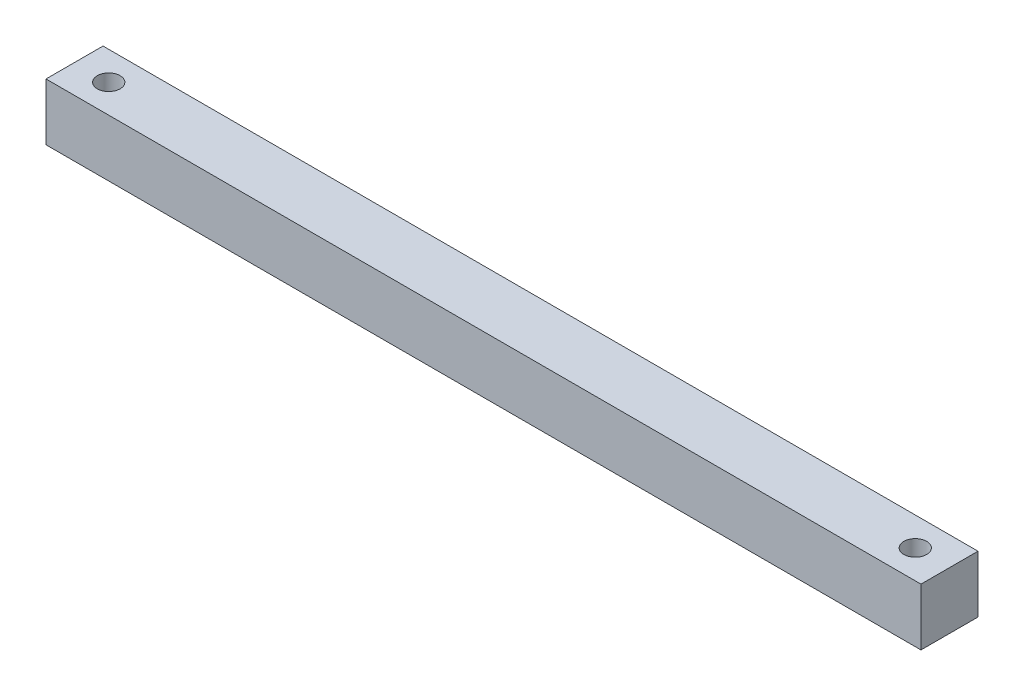
ISO-10303-21;
HEADER;
FILE_DESCRIPTION(('STEP AP214'),'2;1');
FILE_NAME('part.step','',(''),(''),'','','');
FILE_SCHEMA(('AUTOMOTIVE_DESIGN { 1 0 10303 214 1 1 1 1 }'));
ENDSEC;
DATA;
#1=APPLICATION_CONTEXT('core data for automotive mechanical design processes');
#2=APPLICATION_PROTOCOL_DEFINITION('international standard','automotive_design',2000,#1);
#3=PRODUCT_CONTEXT('',#1,'mechanical');
#4=PRODUCT('Part','Part','',(#3));
#5=PRODUCT_RELATED_PRODUCT_CATEGORY('part','',(#4));
#6=PRODUCT_DEFINITION_FORMATION('','',#4);
#7=PRODUCT_DEFINITION_CONTEXT('part definition',#1,'design');
#8=PRODUCT_DEFINITION('design','',#6,#7);
#9=PRODUCT_DEFINITION_SHAPE('','',#8);
#10=(LENGTH_UNIT() NAMED_UNIT(*) SI_UNIT(.MILLI.,.METRE.));
#11=(NAMED_UNIT(*) PLANE_ANGLE_UNIT() SI_UNIT($,.RADIAN.));
#12=(NAMED_UNIT(*) SI_UNIT($,.STERADIAN.) SOLID_ANGLE_UNIT());
#13=UNCERTAINTY_MEASURE_WITH_UNIT(LENGTH_MEASURE(1.E-05),#10,'distance_accuracy_value','');
#14=(GEOMETRIC_REPRESENTATION_CONTEXT(3) GLOBAL_UNCERTAINTY_ASSIGNED_CONTEXT((#13)) GLOBAL_UNIT_ASSIGNED_CONTEXT((#10,
#11,#12)) REPRESENTATION_CONTEXT('',''));
#15=CARTESIAN_POINT('',(0.,0.,0.));
#16=DIRECTION('',(0.,0.,1.));
#17=DIRECTION('',(1.,0.,0.));
#18=AXIS2_PLACEMENT_3D('',#15,#16,#17);
#19=CARTESIAN_POINT('',(38.35533906,2.5,5.));
#20=DIRECTION('',(-1.,0.,0.));
#21=DIRECTION('',(0.,0.,1.));
#22=AXIS2_PLACEMENT_3D('',#19,#20,#21);
#23=PLANE('',#22);
#24=DIRECTION('',(0.,1.,0.));
#25=VECTOR('',#24,1.);
#26=CARTESIAN_POINT('',(38.35533906,2.5,0.));
#27=LINE('',#26,#25);
#28=CARTESIAN_POINT('',(38.35533906,-2.5,0.));
#29=VERTEX_POINT('',#28);
#30=CARTESIAN_POINT('',(38.35533906,2.5,0.));
#31=VERTEX_POINT('',#30);
#32=EDGE_CURVE('E100',#29,#31,#27,.T.);
#33=ORIENTED_EDGE('',*,*,#32,.T.);
#34=DIRECTION('',(0.,0.,-1.));
#35=VECTOR('',#34,1.);
#36=CARTESIAN_POINT('',(38.35533906,2.5,5.));
#37=LINE('',#36,#35);
#38=CARTESIAN_POINT('',(38.35533906,2.5,5.));
#39=VERTEX_POINT('',#38);
#40=EDGE_CURVE('E11',#39,#31,#37,.T.);
#41=ORIENTED_EDGE('',*,*,#40,.F.);
#42=DIRECTION('',(0.,1.,0.));
#43=VECTOR('',#42,1.);
#44=CARTESIAN_POINT('',(38.35533906,2.5,5.));
#45=LINE('',#44,#43);
#46=CARTESIAN_POINT('',(38.35533906,-2.5,5.));
#47=VERTEX_POINT('',#46);
#48=EDGE_CURVE('E88',#47,#39,#45,.T.);
#49=ORIENTED_EDGE('',*,*,#48,.F.);
#50=DIRECTION('',(0.,0.,-1.));
#51=VECTOR('',#50,1.);
#52=CARTESIAN_POINT('',(38.35533906,-2.5,5.));
#53=LINE('',#52,#51);
#54=EDGE_CURVE('E96',#47,#29,#53,.T.);
#55=ORIENTED_EDGE('',*,*,#54,.T.);
#56=EDGE_LOOP('',(#33,#41,#49,#55));
#57=FACE_BOUND('',#56,.T.);
#58=ADVANCED_FACE('F37',(#57),#23,.F.);
#59=CARTESIAN_POINT('',(-38.35533906,2.5,5.));
#60=DIRECTION('',(0.,-1.,0.));
#61=DIRECTION('',(0.,0.,-1.));
#62=AXIS2_PLACEMENT_3D('',#59,#60,#61);
#63=PLANE('',#62);
#64=CARTESIAN_POINT('',(-35.35533906,2.5,2.50000000000001));
#65=DIRECTION('',(0.,1.,0.));
#66=DIRECTION('',(0.,0.,1.));
#67=AXIS2_PLACEMENT_3D('',#64,#65,#66);
#68=CIRCLE('',#67,0.999999999999998);
#69=CARTESIAN_POINT('',(-35.35533906,2.5,3.50000000000001));
#70=VERTEX_POINT('',#69);
#71=EDGE_CURVE('E120',#70,#70,#68,.T.);
#72=ORIENTED_EDGE('',*,*,#71,.F.);
#73=EDGE_LOOP('',(#72));
#74=FACE_BOUND('',#73,.T.);
#75=CARTESIAN_POINT('',(35.35533906,2.5,2.50000000000001));
#76=DIRECTION('',(0.,1.,0.));
#77=DIRECTION('',(0.,0.,1.));
#78=AXIS2_PLACEMENT_3D('',#75,#76,#77);
#79=CIRCLE('',#78,0.999999999999998);
#80=CARTESIAN_POINT('',(35.35533906,2.5,3.50000000000001));
#81=VERTEX_POINT('',#80);
#82=EDGE_CURVE('E117',#81,#81,#79,.T.);
#83=ORIENTED_EDGE('',*,*,#82,.F.);
#84=EDGE_LOOP('',(#83));
#85=FACE_BOUND('',#84,.T.);
#86=DIRECTION('',(-1.,0.,0.));
#87=VECTOR('',#86,1.);
#88=CARTESIAN_POINT('',(-38.35533906,2.5,0.));
#89=LINE('',#88,#87);
#90=CARTESIAN_POINT('',(-38.35533906,2.5,0.));
#91=VERTEX_POINT('',#90);
#92=EDGE_CURVE('E92',#31,#91,#89,.T.);
#93=ORIENTED_EDGE('',*,*,#92,.T.);
#94=DIRECTION('',(0.,0.,-1.));
#95=VECTOR('',#94,1.);
#96=CARTESIAN_POINT('',(-38.35533906,2.5,5.));
#97=LINE('',#96,#95);
#98=CARTESIAN_POINT('',(-38.35533906,2.5,5.));
#99=VERTEX_POINT('',#98);
#100=EDGE_CURVE('E45',#99,#91,#97,.T.);
#101=ORIENTED_EDGE('',*,*,#100,.F.);
#102=DIRECTION('',(-1.,0.,0.));
#103=VECTOR('',#102,1.);
#104=CARTESIAN_POINT('',(-38.35533906,2.5,5.));
#105=LINE('',#104,#103);
#106=EDGE_CURVE('E83',#39,#99,#105,.T.);
#107=ORIENTED_EDGE('',*,*,#106,.F.);
#108=ORIENTED_EDGE('',*,*,#40,.T.);
#109=EDGE_LOOP('',(#93,#101,#107,#108));
#110=FACE_BOUND('',#109,.T.);
#111=ADVANCED_FACE('F91',(#74,#85,#110),#63,.F.);
#112=CARTESIAN_POINT('',(-38.35533906,2.5,5.));
#113=DIRECTION('',(1.,0.,0.));
#114=DIRECTION('',(0.,0.,-1.));
#115=AXIS2_PLACEMENT_3D('',#112,#113,#114);
#116=PLANE('',#115);
#117=DIRECTION('',(0.,-1.,0.));
#118=VECTOR('',#117,1.);
#119=CARTESIAN_POINT('',(-38.35533906,2.5,0.));
#120=LINE('',#119,#118);
#121=CARTESIAN_POINT('',(-38.35533906,-2.5,0.));
#122=VERTEX_POINT('',#121);
#123=EDGE_CURVE('E70',#91,#122,#120,.T.);
#124=ORIENTED_EDGE('',*,*,#123,.T.);
#125=DIRECTION('',(0.,0.,-1.));
#126=VECTOR('',#125,1.);
#127=CARTESIAN_POINT('',(-38.35533906,-2.5,5.));
#128=LINE('',#127,#126);
#129=CARTESIAN_POINT('',(-38.35533906,-2.5,5.));
#130=VERTEX_POINT('',#129);
#131=EDGE_CURVE('E93',#130,#122,#128,.T.);
#132=ORIENTED_EDGE('',*,*,#131,.F.);
#133=DIRECTION('',(0.,-1.,0.));
#134=VECTOR('',#133,1.);
#135=CARTESIAN_POINT('',(-38.35533906,2.5,5.));
#136=LINE('',#135,#134);
#137=EDGE_CURVE('E86',#99,#130,#136,.T.);
#138=ORIENTED_EDGE('',*,*,#137,.F.);
#139=ORIENTED_EDGE('',*,*,#100,.T.);
#140=EDGE_LOOP('',(#124,#132,#138,#139));
#141=FACE_BOUND('',#140,.T.);
#142=ADVANCED_FACE('F94',(#141),#116,.F.);
#143=CARTESIAN_POINT('',(-38.35533906,-2.5,5.));
#144=DIRECTION('',(0.,1.,0.));
#145=DIRECTION('',(0.,0.,1.));
#146=AXIS2_PLACEMENT_3D('',#143,#144,#145);
#147=PLANE('',#146);
#148=CARTESIAN_POINT('',(-35.35533906,-2.5,2.50000000000001));
#149=DIRECTION('',(0.,1.,0.));
#150=DIRECTION('',(0.,0.,1.));
#151=AXIS2_PLACEMENT_3D('',#148,#149,#150);
#152=CIRCLE('',#151,0.999999999999998);
#153=CARTESIAN_POINT('',(-35.35533906,-2.5,3.50000000000001));
#154=VERTEX_POINT('',#153);
#155=EDGE_CURVE('E103',#154,#154,#152,.T.);
#156=ORIENTED_EDGE('',*,*,#155,.T.);
#157=EDGE_LOOP('',(#156));
#158=FACE_BOUND('',#157,.T.);
#159=CARTESIAN_POINT('',(35.35533906,-2.5,2.50000000000001));
#160=DIRECTION('',(0.,1.,0.));
#161=DIRECTION('',(0.,0.,1.));
#162=AXIS2_PLACEMENT_3D('',#159,#160,#161);
#163=CIRCLE('',#162,0.999999999999998);
#164=CARTESIAN_POINT('',(35.35533906,-2.5,3.50000000000001));
#165=VERTEX_POINT('',#164);
#166=EDGE_CURVE('E114',#165,#165,#163,.T.);
#167=ORIENTED_EDGE('',*,*,#166,.T.);
#168=EDGE_LOOP('',(#167));
#169=FACE_BOUND('',#168,.T.);
#170=DIRECTION('',(1.,0.,0.));
#171=VECTOR('',#170,1.);
#172=CARTESIAN_POINT('',(-38.35533906,-2.5,0.));
#173=LINE('',#172,#171);
#174=EDGE_CURVE('E76',#122,#29,#173,.T.);
#175=ORIENTED_EDGE('',*,*,#174,.T.);
#176=ORIENTED_EDGE('',*,*,#54,.F.);
#177=DIRECTION('',(1.,0.,0.));
#178=VECTOR('',#177,1.);
#179=CARTESIAN_POINT('',(-38.35533906,-2.5,5.));
#180=LINE('',#179,#178);
#181=EDGE_CURVE('E53',#130,#47,#180,.T.);
#182=ORIENTED_EDGE('',*,*,#181,.F.);
#183=ORIENTED_EDGE('',*,*,#131,.T.);
#184=EDGE_LOOP('',(#175,#176,#182,#183));
#185=FACE_BOUND('',#184,.T.);
#186=ADVANCED_FACE('F108',(#158,#169,#185),#147,.F.);
#187=CARTESIAN_POINT('',(0.,0.,5.));
#188=DIRECTION('',(0.,0.,1.));
#189=DIRECTION('',(1.,0.,0.));
#190=AXIS2_PLACEMENT_3D('',#187,#188,#189);
#191=PLANE('',#190);
#192=ORIENTED_EDGE('',*,*,#48,.T.);
#193=ORIENTED_EDGE('',*,*,#106,.T.);
#194=ORIENTED_EDGE('',*,*,#137,.T.);
#195=ORIENTED_EDGE('',*,*,#181,.T.);
#196=EDGE_LOOP('',(#192,#193,#194,#195));
#197=FACE_BOUND('',#196,.T.);
#198=ADVANCED_FACE('F84',(#197),#191,.T.);
#199=CARTESIAN_POINT('',(0.,0.,0.));
#200=DIRECTION('',(0.,0.,1.));
#201=DIRECTION('',(1.,0.,0.));
#202=AXIS2_PLACEMENT_3D('',#199,#200,#201);
#203=PLANE('',#202);
#204=ORIENTED_EDGE('',*,*,#32,.F.);
#205=ORIENTED_EDGE('',*,*,#174,.F.);
#206=ORIENTED_EDGE('',*,*,#123,.F.);
#207=ORIENTED_EDGE('',*,*,#92,.F.);
#208=EDGE_LOOP('',(#204,#205,#206,#207));
#209=FACE_BOUND('',#208,.T.);
#210=ADVANCED_FACE('F111',(#209),#203,.F.);
#211=CARTESIAN_POINT('',(35.35533906,-2.5,2.50000000000001));
#212=DIRECTION('',(0.,1.,0.));
#213=DIRECTION('',(0.,0.,1.));
#214=AXIS2_PLACEMENT_3D('',#211,#212,#213);
#215=CYLINDRICAL_SURFACE('',#214,0.999999999999998);
#216=ORIENTED_EDGE('',*,*,#166,.F.);
#217=EDGE_LOOP('',(#216));
#218=FACE_BOUND('',#217,.T.);
#219=ORIENTED_EDGE('',*,*,#82,.T.);
#220=EDGE_LOOP('',(#219));
#221=FACE_BOUND('',#220,.T.);
#222=ADVANCED_FACE('F131',(#218,#221),#215,.F.);
#223=CARTESIAN_POINT('',(-35.35533906,-2.5,2.50000000000001));
#224=DIRECTION('',(0.,1.,0.));
#225=DIRECTION('',(0.,0.,1.));
#226=AXIS2_PLACEMENT_3D('',#223,#224,#225);
#227=CYLINDRICAL_SURFACE('',#226,0.999999999999998);
#228=ORIENTED_EDGE('',*,*,#155,.F.);
#229=EDGE_LOOP('',(#228));
#230=FACE_BOUND('',#229,.T.);
#231=ORIENTED_EDGE('',*,*,#71,.T.);
#232=EDGE_LOOP('',(#231));
#233=FACE_BOUND('',#232,.T.);
#234=ADVANCED_FACE('F128',(#230,#233),#227,.F.);
#235=CLOSED_SHELL('',(#58,#111,#142,#186,#198,#210,#222,#234));
#236=MANIFOLD_SOLID_BREP('B2',#235);
#237=ADVANCED_BREP_SHAPE_REPRESENTATION('',(#18,#236),#14);
#238=SHAPE_DEFINITION_REPRESENTATION(#9,#237);
ENDSEC;
END-ISO-10303-21;
